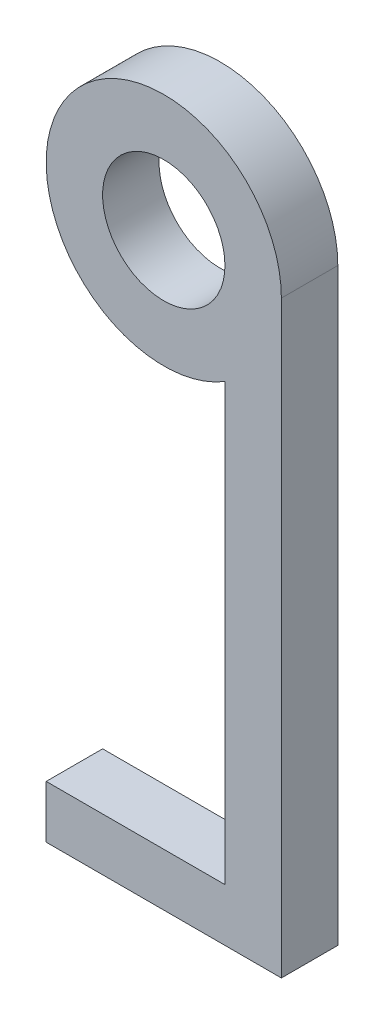
ISO-10303-21;
HEADER;
FILE_DESCRIPTION(('STEP AP214'),'2;1');
FILE_NAME('part.step','',(''),(''),'','','');
FILE_SCHEMA(('AUTOMOTIVE_DESIGN { 1 0 10303 214 1 1 1 1 }'));
ENDSEC;
DATA;
#1=APPLICATION_CONTEXT('core data for automotive mechanical design processes');
#2=APPLICATION_PROTOCOL_DEFINITION('international standard','automotive_design',2000,#1);
#3=PRODUCT_CONTEXT('',#1,'mechanical');
#4=PRODUCT('Part','Part','',(#3));
#5=PRODUCT_RELATED_PRODUCT_CATEGORY('part','',(#4));
#6=PRODUCT_DEFINITION_FORMATION('','',#4);
#7=PRODUCT_DEFINITION_CONTEXT('part definition',#1,'design');
#8=PRODUCT_DEFINITION('design','',#6,#7);
#9=PRODUCT_DEFINITION_SHAPE('','',#8);
#10=(LENGTH_UNIT() NAMED_UNIT(*) SI_UNIT(.MILLI.,.METRE.));
#11=(NAMED_UNIT(*) PLANE_ANGLE_UNIT() SI_UNIT($,.RADIAN.));
#12=(NAMED_UNIT(*) SI_UNIT($,.STERADIAN.) SOLID_ANGLE_UNIT());
#13=UNCERTAINTY_MEASURE_WITH_UNIT(LENGTH_MEASURE(1.E-05),#10,'distance_accuracy_value','');
#14=(GEOMETRIC_REPRESENTATION_CONTEXT(3) GLOBAL_UNCERTAINTY_ASSIGNED_CONTEXT((#13)) GLOBAL_UNIT_ASSIGNED_CONTEXT((#10,
#11,#12)) REPRESENTATION_CONTEXT('',''));
#15=CARTESIAN_POINT('',(0.,0.,0.));
#16=DIRECTION('',(0.,0.,1.));
#17=DIRECTION('',(1.,0.,0.));
#18=AXIS2_PLACEMENT_3D('',#15,#16,#17);
#19=CARTESIAN_POINT('',(0.,-6.2622,0.));
#20=DIRECTION('',(0.,0.,1.));
#21=DIRECTION('',(1.,0.,0.));
#22=AXIS2_PLACEMENT_3D('',#19,#20,#21);
#23=PLANE('',#22);
#24=CARTESIAN_POINT('',(0.,0.,0.));
#25=DIRECTION('',(0.,0.,1.));
#26=DIRECTION('',(1.,0.,0.));
#27=AXIS2_PLACEMENT_3D('',#24,#25,#26);
#28=CIRCLE('',#27,1.6256);
#29=CARTESIAN_POINT('',(1.6256,0.,0.));
#30=VERTEX_POINT('',#29);
#31=EDGE_CURVE('E112',#30,#30,#28,.T.);
#32=ORIENTED_EDGE('',*,*,#31,.T.);
#33=EDGE_LOOP('',(#32));
#34=FACE_BOUND('',#33,.T.);
#35=DIRECTION('',(0.,1.,0.));
#36=VECTOR('',#35,1.);
#37=CARTESIAN_POINT('',(3.1256,-15.65,0.));
#38=LINE('',#37,#36);
#39=CARTESIAN_POINT('',(3.1256,-15.65,0.));
#40=VERTEX_POINT('',#39);
#41=CARTESIAN_POINT('',(3.1256,0.,0.));
#42=VERTEX_POINT('',#41);
#43=EDGE_CURVE('E70',#40,#42,#38,.T.);
#44=ORIENTED_EDGE('',*,*,#43,.F.);
#45=DIRECTION('',(1.,0.,0.));
#46=VECTOR('',#45,1.);
#47=CARTESIAN_POINT('',(-3.1256,-15.65,0.));
#48=LINE('',#47,#46);
#49=CARTESIAN_POINT('',(-3.1256,-15.65,0.));
#50=VERTEX_POINT('',#49);
#51=EDGE_CURVE('E87',#50,#40,#48,.T.);
#52=ORIENTED_EDGE('',*,*,#51,.F.);
#53=DIRECTION('',(0.,1.,0.));
#54=VECTOR('',#53,1.);
#55=CARTESIAN_POINT('',(-3.1256,-14.25,0.));
#56=LINE('',#55,#54);
#57=CARTESIAN_POINT('',(-3.1256,-14.25,0.));
#58=VERTEX_POINT('',#57);
#59=EDGE_CURVE('E95',#58,#50,#56,.F.);
#60=ORIENTED_EDGE('',*,*,#59,.F.);
#61=DIRECTION('',(1.,0.,0.));
#62=VECTOR('',#61,1.);
#63=CARTESIAN_POINT('',(1.6256,-14.25,0.));
#64=LINE('',#63,#62);
#65=CARTESIAN_POINT('',(1.6256,-14.25,0.));
#66=VERTEX_POINT('',#65);
#67=EDGE_CURVE('E102',#66,#58,#64,.F.);
#68=ORIENTED_EDGE('',*,*,#67,.F.);
#69=DIRECTION('',(0.,1.,0.));
#70=VECTOR('',#69,1.);
#71=CARTESIAN_POINT('',(1.6256,-2.66960671260768,0.));
#72=LINE('',#71,#70);
#73=CARTESIAN_POINT('',(1.6256,-2.66960671260768,0.));
#74=VERTEX_POINT('',#73);
#75=EDGE_CURVE('E72',#74,#66,#72,.F.);
#76=ORIENTED_EDGE('',*,*,#75,.F.);
#77=CARTESIAN_POINT('',(0.,0.,0.));
#78=DIRECTION('',(0.,0.,1.));
#79=DIRECTION('',(1.,0.,0.));
#80=AXIS2_PLACEMENT_3D('',#77,#78,#79);
#81=CIRCLE('',#80,3.1256);
#82=EDGE_CURVE('E20',#42,#74,#81,.T.);
#83=ORIENTED_EDGE('',*,*,#82,.F.);
#84=EDGE_LOOP('',(#44,#52,#60,#68,#76,#83));
#85=FACE_BOUND('',#84,.T.);
#86=ADVANCED_FACE('F17',(#34,#85),#23,.F.);
#87=CARTESIAN_POINT('',(0.,0.,0.));
#88=DIRECTION('',(0.,0.,1.));
#89=DIRECTION('',(1.,0.,0.));
#90=AXIS2_PLACEMENT_3D('',#87,#88,#89);
#91=CYLINDRICAL_SURFACE('',#90,3.1256);
#92=CARTESIAN_POINT('',(0.,0.,1.5));
#93=DIRECTION('',(0.,0.,1.));
#94=DIRECTION('',(1.,0.,0.));
#95=AXIS2_PLACEMENT_3D('',#92,#93,#94);
#96=CIRCLE('',#95,3.1256);
#97=CARTESIAN_POINT('',(3.1256,0.,1.5));
#98=VERTEX_POINT('',#97);
#99=CARTESIAN_POINT('',(1.6256,-2.66960671260768,1.5));
#100=VERTEX_POINT('',#99);
#101=EDGE_CURVE('E79',#98,#100,#96,.T.);
#102=ORIENTED_EDGE('',*,*,#101,.F.);
#103=DIRECTION('',(0.,0.,-1.));
#104=VECTOR('',#103,1.);
#105=CARTESIAN_POINT('',(3.1256,0.,0.));
#106=LINE('',#105,#104);
#107=EDGE_CURVE('E76',#42,#98,#106,.F.);
#108=ORIENTED_EDGE('',*,*,#107,.F.);
#109=ORIENTED_EDGE('',*,*,#82,.T.);
#110=DIRECTION('',(0.,0.,1.));
#111=VECTOR('',#110,1.);
#112=CARTESIAN_POINT('',(1.6256,-2.66960671260768,0.));
#113=LINE('',#112,#111);
#114=EDGE_CURVE('E105',#100,#74,#113,.F.);
#115=ORIENTED_EDGE('',*,*,#114,.F.);
#116=EDGE_LOOP('',(#102,#108,#109,#115));
#117=FACE_BOUND('',#116,.T.);
#118=ADVANCED_FACE('F77',(#117),#91,.T.);
#119=CARTESIAN_POINT('',(1.6256,-2.66960671260768,0.));
#120=DIRECTION('',(-1.,0.,0.));
#121=DIRECTION('',(0.,0.,1.));
#122=AXIS2_PLACEMENT_3D('',#119,#120,#121);
#123=PLANE('',#122);
#124=DIRECTION('',(0.,1.,0.));
#125=VECTOR('',#124,1.);
#126=CARTESIAN_POINT('',(1.6256,-6.2622,1.5));
#127=LINE('',#126,#125);
#128=CARTESIAN_POINT('',(1.6256,-14.25,1.5));
#129=VERTEX_POINT('',#128);
#130=EDGE_CURVE('E111',#100,#129,#127,.F.);
#131=ORIENTED_EDGE('',*,*,#130,.F.);
#132=ORIENTED_EDGE('',*,*,#114,.T.);
#133=ORIENTED_EDGE('',*,*,#75,.T.);
#134=DIRECTION('',(0.,0.,1.));
#135=VECTOR('',#134,1.);
#136=CARTESIAN_POINT('',(1.6256,-14.25,0.));
#137=LINE('',#136,#135);
#138=EDGE_CURVE('E99',#129,#66,#137,.F.);
#139=ORIENTED_EDGE('',*,*,#138,.F.);
#140=EDGE_LOOP('',(#131,#132,#133,#139));
#141=FACE_BOUND('',#140,.T.);
#142=ADVANCED_FACE('F156',(#141),#123,.T.);
#143=CARTESIAN_POINT('',(1.6256,-14.25,0.));
#144=DIRECTION('',(0.,1.,0.));
#145=DIRECTION('',(0.,0.,1.));
#146=AXIS2_PLACEMENT_3D('',#143,#144,#145);
#147=PLANE('',#146);
#148=DIRECTION('',(1.,0.,0.));
#149=VECTOR('',#148,1.);
#150=CARTESIAN_POINT('',(0.,-14.25,1.5));
#151=LINE('',#150,#149);
#152=CARTESIAN_POINT('',(-3.1256,-14.25,1.5));
#153=VERTEX_POINT('',#152);
#154=EDGE_CURVE('E131',#129,#153,#151,.F.);
#155=ORIENTED_EDGE('',*,*,#154,.F.);
#156=ORIENTED_EDGE('',*,*,#138,.T.);
#157=ORIENTED_EDGE('',*,*,#67,.T.);
#158=DIRECTION('',(0.,0.,1.));
#159=VECTOR('',#158,1.);
#160=CARTESIAN_POINT('',(-3.1256,-14.25,0.));
#161=LINE('',#160,#159);
#162=EDGE_CURVE('E98',#153,#58,#161,.F.);
#163=ORIENTED_EDGE('',*,*,#162,.F.);
#164=EDGE_LOOP('',(#155,#156,#157,#163));
#165=FACE_BOUND('',#164,.T.);
#166=ADVANCED_FACE('F152',(#165),#147,.T.);
#167=CARTESIAN_POINT('',(-3.1256,-14.25,0.));
#168=DIRECTION('',(-1.,0.,0.));
#169=DIRECTION('',(0.,0.,1.));
#170=AXIS2_PLACEMENT_3D('',#167,#168,#169);
#171=PLANE('',#170);
#172=DIRECTION('',(0.,1.,0.));
#173=VECTOR('',#172,1.);
#174=CARTESIAN_POINT('',(-3.1256,-6.2622,1.5));
#175=LINE('',#174,#173);
#176=CARTESIAN_POINT('',(-3.1256,-15.65,1.5));
#177=VERTEX_POINT('',#176);
#178=EDGE_CURVE('E124',#153,#177,#175,.F.);
#179=ORIENTED_EDGE('',*,*,#178,.F.);
#180=ORIENTED_EDGE('',*,*,#162,.T.);
#181=ORIENTED_EDGE('',*,*,#59,.T.);
#182=DIRECTION('',(0.,0.,-1.));
#183=VECTOR('',#182,1.);
#184=CARTESIAN_POINT('',(-3.1256,-15.65,0.));
#185=LINE('',#184,#183);
#186=EDGE_CURVE('E84',#177,#50,#185,.T.);
#187=ORIENTED_EDGE('',*,*,#186,.F.);
#188=EDGE_LOOP('',(#179,#180,#181,#187));
#189=FACE_BOUND('',#188,.T.);
#190=ADVANCED_FACE('F149',(#189),#171,.T.);
#191=CARTESIAN_POINT('',(-3.1256,-15.65,0.));
#192=DIRECTION('',(0.,-1.,0.));
#193=DIRECTION('',(0.,0.,-1.));
#194=AXIS2_PLACEMENT_3D('',#191,#192,#193);
#195=PLANE('',#194);
#196=DIRECTION('',(1.,0.,0.));
#197=VECTOR('',#196,1.);
#198=CARTESIAN_POINT('',(0.,-15.65,1.5));
#199=LINE('',#198,#197);
#200=CARTESIAN_POINT('',(3.1256,-15.65,1.5));
#201=VERTEX_POINT('',#200);
#202=EDGE_CURVE('E121',#177,#201,#199,.T.);
#203=ORIENTED_EDGE('',*,*,#202,.F.);
#204=ORIENTED_EDGE('',*,*,#186,.T.);
#205=ORIENTED_EDGE('',*,*,#51,.T.);
#206=DIRECTION('',(0.,0.,-1.));
#207=VECTOR('',#206,1.);
#208=CARTESIAN_POINT('',(3.1256,-15.65,0.));
#209=LINE('',#208,#207);
#210=EDGE_CURVE('E35',#201,#40,#209,.T.);
#211=ORIENTED_EDGE('',*,*,#210,.F.);
#212=EDGE_LOOP('',(#203,#204,#205,#211));
#213=FACE_BOUND('',#212,.T.);
#214=ADVANCED_FACE('F146',(#213),#195,.T.);
#215=CARTESIAN_POINT('',(3.1256,-15.65,0.));
#216=DIRECTION('',(1.,0.,0.));
#217=DIRECTION('',(0.,0.,-1.));
#218=AXIS2_PLACEMENT_3D('',#215,#216,#217);
#219=PLANE('',#218);
#220=DIRECTION('',(0.,1.,0.));
#221=VECTOR('',#220,1.);
#222=CARTESIAN_POINT('',(3.1256,-6.2622,1.5));
#223=LINE('',#222,#221);
#224=EDGE_CURVE('E26',#201,#98,#223,.T.);
#225=ORIENTED_EDGE('',*,*,#224,.F.);
#226=ORIENTED_EDGE('',*,*,#210,.T.);
#227=ORIENTED_EDGE('',*,*,#43,.T.);
#228=ORIENTED_EDGE('',*,*,#107,.T.);
#229=EDGE_LOOP('',(#225,#226,#227,#228));
#230=FACE_BOUND('',#229,.T.);
#231=ADVANCED_FACE('F83',(#230),#219,.T.);
#232=CARTESIAN_POINT('',(0.,0.,0.));
#233=DIRECTION('',(0.,0.,1.));
#234=DIRECTION('',(1.,0.,0.));
#235=AXIS2_PLACEMENT_3D('',#232,#233,#234);
#236=CYLINDRICAL_SURFACE('',#235,1.6256);
#237=ORIENTED_EDGE('',*,*,#31,.F.);
#238=EDGE_LOOP('',(#237));
#239=FACE_BOUND('',#238,.T.);
#240=CARTESIAN_POINT('',(0.,0.,1.5));
#241=DIRECTION('',(0.,0.,1.));
#242=DIRECTION('',(1.,0.,0.));
#243=AXIS2_PLACEMENT_3D('',#240,#241,#242);
#244=CIRCLE('',#243,1.6256);
#245=CARTESIAN_POINT('',(1.6256,0.,1.5));
#246=VERTEX_POINT('',#245);
#247=EDGE_CURVE('E11',#246,#246,#244,.F.);
#248=ORIENTED_EDGE('',*,*,#247,.F.);
#249=EDGE_LOOP('',(#248));
#250=FACE_BOUND('',#249,.T.);
#251=ADVANCED_FACE('F165',(#239,#250),#236,.F.);
#252=CARTESIAN_POINT('',(0.,-6.2622,1.5));
#253=DIRECTION('',(0.,0.,1.));
#254=DIRECTION('',(1.,0.,0.));
#255=AXIS2_PLACEMENT_3D('',#252,#253,#254);
#256=PLANE('',#255);
#257=ORIENTED_EDGE('',*,*,#247,.T.);
#258=EDGE_LOOP('',(#257));
#259=FACE_BOUND('',#258,.T.);
#260=ORIENTED_EDGE('',*,*,#202,.T.);
#261=ORIENTED_EDGE('',*,*,#224,.T.);
#262=ORIENTED_EDGE('',*,*,#101,.T.);
#263=ORIENTED_EDGE('',*,*,#130,.T.);
#264=ORIENTED_EDGE('',*,*,#154,.T.);
#265=ORIENTED_EDGE('',*,*,#178,.T.);
#266=EDGE_LOOP('',(#260,#261,#262,#263,#264,#265));
#267=FACE_BOUND('',#266,.T.);
#268=ADVANCED_FACE('F159',(#259,#267),#256,.T.);
#269=CLOSED_SHELL('',(#86,#118,#142,#166,#190,#214,#231,#251,#268));
#270=MANIFOLD_SOLID_BREP('B1',#269);
#271=ADVANCED_BREP_SHAPE_REPRESENTATION('',(#18,#270),#14);
#272=SHAPE_DEFINITION_REPRESENTATION(#9,#271);
ENDSEC;
END-ISO-10303-21;
